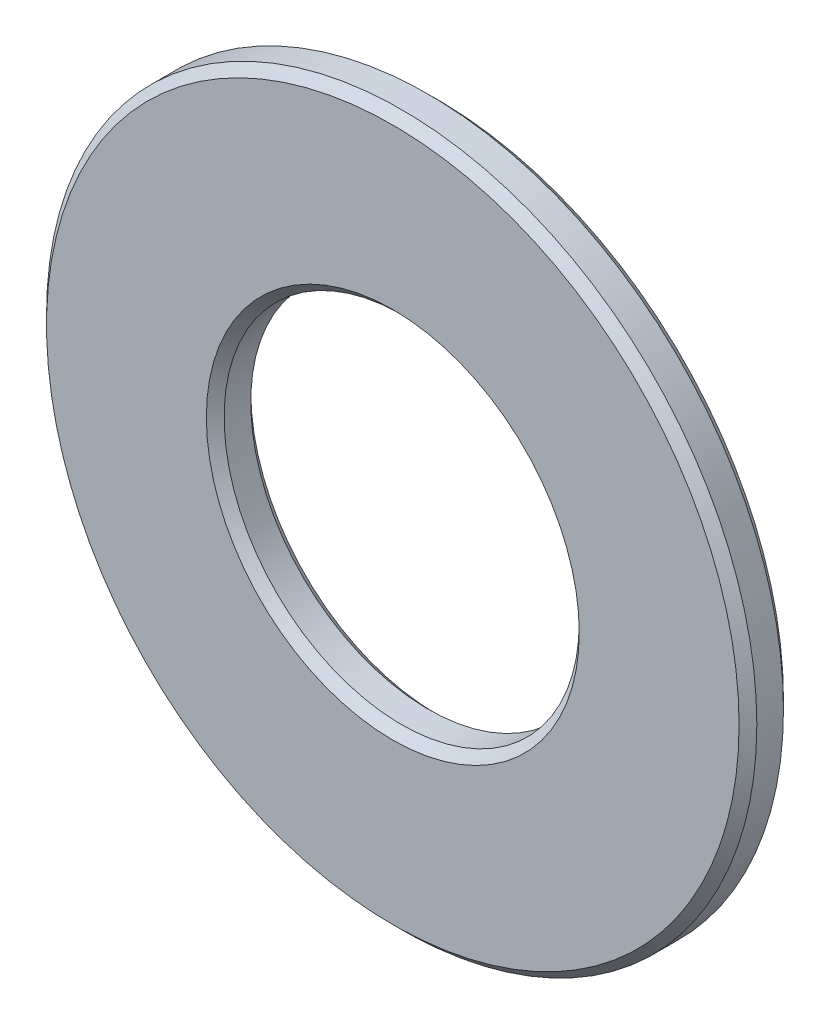
ISO-10303-21;
HEADER;
FILE_DESCRIPTION(('STEP AP214'),'2;1');
FILE_NAME('part.step','',(''),(''),'','','');
FILE_SCHEMA(('AUTOMOTIVE_DESIGN { 1 0 10303 214 1 1 1 1 }'));
ENDSEC;
DATA;
#1=APPLICATION_CONTEXT('core data for automotive mechanical design processes');
#2=APPLICATION_PROTOCOL_DEFINITION('international standard','automotive_design',2000,#1);
#3=PRODUCT_CONTEXT('',#1,'mechanical');
#4=PRODUCT('Part','Part','',(#3));
#5=PRODUCT_RELATED_PRODUCT_CATEGORY('part','',(#4));
#6=PRODUCT_DEFINITION_FORMATION('','',#4);
#7=PRODUCT_DEFINITION_CONTEXT('part definition',#1,'design');
#8=PRODUCT_DEFINITION('design','',#6,#7);
#9=PRODUCT_DEFINITION_SHAPE('','',#8);
#10=(LENGTH_UNIT() NAMED_UNIT(*) SI_UNIT(.MILLI.,.METRE.));
#11=(NAMED_UNIT(*) PLANE_ANGLE_UNIT() SI_UNIT($,.RADIAN.));
#12=(NAMED_UNIT(*) SI_UNIT($,.STERADIAN.) SOLID_ANGLE_UNIT());
#13=UNCERTAINTY_MEASURE_WITH_UNIT(LENGTH_MEASURE(1.E-05),#10,'distance_accuracy_value','');
#14=(GEOMETRIC_REPRESENTATION_CONTEXT(3) GLOBAL_UNCERTAINTY_ASSIGNED_CONTEXT((#13)) GLOBAL_UNIT_ASSIGNED_CONTEXT((#10,
#11,#12)) REPRESENTATION_CONTEXT('',''));
#15=CARTESIAN_POINT('',(0.,0.,0.));
#16=DIRECTION('',(0.,0.,1.));
#17=DIRECTION('',(1.,0.,0.));
#18=AXIS2_PLACEMENT_3D('',#15,#16,#17);
#19=CARTESIAN_POINT('',(0.,0.,0.25));
#20=DIRECTION('',(0.,0.,1.));
#21=DIRECTION('',(1.,0.,0.));
#22=AXIS2_PLACEMENT_3D('',#19,#20,#21);
#23=PLANE('',#22);
#24=CARTESIAN_POINT('',(0.,0.,0.25));
#25=DIRECTION('',(0.,0.,1.));
#26=DIRECTION('',(1.,0.,0.));
#27=AXIS2_PLACEMENT_3D('',#24,#25,#26);
#28=CIRCLE('',#27,2.1);
#29=CARTESIAN_POINT('',(2.1,0.,0.25));
#30=VERTEX_POINT('',#29);
#31=EDGE_CURVE('E56',#30,#30,#28,.F.);
#32=ORIENTED_EDGE('',*,*,#31,.T.);
#33=EDGE_LOOP('',(#32));
#34=FACE_BOUND('',#33,.T.);
#35=CARTESIAN_POINT('',(0.,0.,0.25));
#36=DIRECTION('',(0.,0.,1.));
#37=DIRECTION('',(1.,0.,0.));
#38=AXIS2_PLACEMENT_3D('',#35,#36,#37);
#39=CIRCLE('',#38,3.9);
#40=CARTESIAN_POINT('',(3.9,0.,0.25));
#41=VERTEX_POINT('',#40);
#42=EDGE_CURVE('E59',#41,#41,#39,.T.);
#43=ORIENTED_EDGE('',*,*,#42,.T.);
#44=EDGE_LOOP('',(#43));
#45=FACE_BOUND('',#44,.T.);
#46=ADVANCED_FACE('F35',(#34,#45),#23,.T.);
#47=CARTESIAN_POINT('',(0.,0.,-0.25));
#48=DIRECTION('',(0.,0.,1.));
#49=DIRECTION('',(1.,0.,0.));
#50=AXIS2_PLACEMENT_3D('',#47,#48,#49);
#51=PLANE('',#50);
#52=CARTESIAN_POINT('',(0.,0.,-0.25));
#53=DIRECTION('',(0.,0.,1.));
#54=DIRECTION('',(1.,0.,0.));
#55=AXIS2_PLACEMENT_3D('',#52,#53,#54);
#56=CIRCLE('',#55,2.1);
#57=CARTESIAN_POINT('',(2.1,0.,-0.25));
#58=VERTEX_POINT('',#57);
#59=EDGE_CURVE('E47',#58,#58,#56,.T.);
#60=ORIENTED_EDGE('',*,*,#59,.T.);
#61=EDGE_LOOP('',(#60));
#62=FACE_BOUND('',#61,.T.);
#63=CARTESIAN_POINT('',(0.,0.,-0.25));
#64=DIRECTION('',(0.,0.,1.));
#65=DIRECTION('',(1.,0.,0.));
#66=AXIS2_PLACEMENT_3D('',#63,#64,#65);
#67=CIRCLE('',#66,3.9);
#68=CARTESIAN_POINT('',(3.9,0.,-0.25));
#69=VERTEX_POINT('',#68);
#70=EDGE_CURVE('E51',#69,#69,#67,.F.);
#71=ORIENTED_EDGE('',*,*,#70,.T.);
#72=EDGE_LOOP('',(#71));
#73=FACE_BOUND('',#72,.T.);
#74=ADVANCED_FACE('F79',(#62,#73),#51,.F.);
#75=CARTESIAN_POINT('',(0.,0.,0.25));
#76=DIRECTION('',(0.,0.,-1.));
#77=DIRECTION('',(-1.,0.,0.));
#78=AXIS2_PLACEMENT_3D('',#75,#76,#77);
#79=CYLINDRICAL_SURFACE('',#78,4.);
#80=CARTESIAN_POINT('',(0.,0.,-0.150000000000001));
#81=DIRECTION('',(0.,0.,1.));
#82=DIRECTION('',(1.,0.,0.));
#83=AXIS2_PLACEMENT_3D('',#80,#81,#82);
#84=CIRCLE('',#83,4.);
#85=CARTESIAN_POINT('',(4.,0.,-0.150000000000001));
#86=VERTEX_POINT('',#85);
#87=EDGE_CURVE('E10',#86,#86,#84,.T.);
#88=ORIENTED_EDGE('',*,*,#87,.T.);
#89=EDGE_LOOP('',(#88));
#90=FACE_BOUND('',#89,.T.);
#91=CARTESIAN_POINT('',(0.,0.,0.150000000000002));
#92=DIRECTION('',(0.,0.,1.));
#93=DIRECTION('',(1.,0.,0.));
#94=AXIS2_PLACEMENT_3D('',#91,#92,#93);
#95=CIRCLE('',#94,4.);
#96=CARTESIAN_POINT('',(4.,0.,0.150000000000002));
#97=VERTEX_POINT('',#96);
#98=EDGE_CURVE('E43',#97,#97,#95,.F.);
#99=ORIENTED_EDGE('',*,*,#98,.T.);
#100=EDGE_LOOP('',(#99));
#101=FACE_BOUND('',#100,.T.);
#102=ADVANCED_FACE('F82',(#90,#101),#79,.T.);
#103=CARTESIAN_POINT('',(0.,0.,0.25));
#104=DIRECTION('',(0.,0.,-1.));
#105=DIRECTION('',(-1.,0.,0.));
#106=AXIS2_PLACEMENT_3D('',#103,#104,#105);
#107=CYLINDRICAL_SURFACE('',#106,2.);
#108=CARTESIAN_POINT('',(0.,0.,0.150000000000003));
#109=DIRECTION('',(0.,0.,1.));
#110=DIRECTION('',(1.,0.,0.));
#111=AXIS2_PLACEMENT_3D('',#108,#109,#110);
#112=CIRCLE('',#111,2.);
#113=CARTESIAN_POINT('',(2.,0.,0.150000000000003));
#114=VERTEX_POINT('',#113);
#115=EDGE_CURVE('E62',#114,#114,#112,.T.);
#116=ORIENTED_EDGE('',*,*,#115,.T.);
#117=EDGE_LOOP('',(#116));
#118=FACE_BOUND('',#117,.T.);
#119=CARTESIAN_POINT('',(0.,0.,-0.150000000000001));
#120=DIRECTION('',(0.,0.,1.));
#121=DIRECTION('',(1.,0.,0.));
#122=AXIS2_PLACEMENT_3D('',#119,#120,#121);
#123=CIRCLE('',#122,2.);
#124=CARTESIAN_POINT('',(2.,0.,-0.150000000000001));
#125=VERTEX_POINT('',#124);
#126=EDGE_CURVE('E65',#125,#125,#123,.F.);
#127=ORIENTED_EDGE('',*,*,#126,.T.);
#128=EDGE_LOOP('',(#127));
#129=FACE_BOUND('',#128,.T.);
#130=ADVANCED_FACE('F69',(#118,#129),#107,.F.);
#131=CARTESIAN_POINT('',(0.,0.,0.150000000000003));
#132=DIRECTION('',(0.,0.,1.));
#133=DIRECTION('',(1.,0.,0.));
#134=AXIS2_PLACEMENT_3D('',#131,#132,#133);
#135=CONICAL_SURFACE('',#134,2.,0.785398163397453);
#136=CARTESIAN_POINT('',(2.1,0.,0.25));
#137=CARTESIAN_POINT('',(2.09895833333333,0.,0.248958333333333));
#138=CARTESIAN_POINT('',(2.09791666666666,0.,0.247916666666667));
#139=CARTESIAN_POINT('',(2.09583333333333,0.,0.245833333333333));
#140=CARTESIAN_POINT('',(2.09479166666666,0.,0.244791666666667));
#141=CARTESIAN_POINT('',(2.09270833333333,0.,0.242708333333333));
#142=CARTESIAN_POINT('',(2.09166666666666,0.,0.241666666666667));
#143=CARTESIAN_POINT('',(2.08958333333333,0.,0.239583333333334));
#144=CARTESIAN_POINT('',(2.08854166666666,0.,0.238541666666667));
#145=CARTESIAN_POINT('',(2.08645833333333,0.,0.236458333333334));
#146=CARTESIAN_POINT('',(2.08541666666666,0.,0.235416666666667));
#147=CARTESIAN_POINT('',(2.08333333333333,0.,0.233333333333334));
#148=CARTESIAN_POINT('',(2.08229166666666,0.,0.232291666666667));
#149=CARTESIAN_POINT('',(2.08020833333333,0.,0.230208333333334));
#150=CARTESIAN_POINT('',(2.07916666666666,0.,0.229166666666667));
#151=CARTESIAN_POINT('',(2.07708333333333,0.,0.227083333333334));
#152=CARTESIAN_POINT('',(2.07604166666667,0.,0.226041666666667));
#153=CARTESIAN_POINT('',(2.07395833333333,0.,0.223958333333334));
#154=CARTESIAN_POINT('',(2.07291666666666,0.,0.222916666666668));
#155=CARTESIAN_POINT('',(2.07083333333333,0.,0.220833333333334));
#156=CARTESIAN_POINT('',(2.06979166666666,0.,0.219791666666668));
#157=CARTESIAN_POINT('',(2.06770833333333,0.,0.217708333333334));
#158=CARTESIAN_POINT('',(2.06666666666667,0.,0.216666666666668));
#159=CARTESIAN_POINT('',(2.06458333333333,0.,0.214583333333334));
#160=CARTESIAN_POINT('',(2.06354166666666,0.,0.213541666666668));
#161=CARTESIAN_POINT('',(2.06145833333333,0.,0.211458333333335));
#162=CARTESIAN_POINT('',(2.06041666666667,0.,0.210416666666668));
#163=CARTESIAN_POINT('',(2.05833333333333,0.,0.208333333333335));
#164=CARTESIAN_POINT('',(2.05729166666667,0.,0.207291666666668));
#165=CARTESIAN_POINT('',(2.05520833333333,0.,0.205208333333335));
#166=CARTESIAN_POINT('',(2.05416666666667,0.,0.204166666666668));
#167=CARTESIAN_POINT('',(2.05208333333333,0.,0.202083333333335));
#168=CARTESIAN_POINT('',(2.05104166666667,0.,0.201041666666668));
#169=CARTESIAN_POINT('',(2.04895833333333,0.,0.198958333333335));
#170=CARTESIAN_POINT('',(2.04791666666667,0.,0.197916666666668));
#171=CARTESIAN_POINT('',(2.04583333333333,0.,0.195833333333335));
#172=CARTESIAN_POINT('',(2.04479166666667,0.,0.194791666666668));
#173=CARTESIAN_POINT('',(2.04270833333333,0.,0.192708333333335));
#174=CARTESIAN_POINT('',(2.04166666666667,0.,0.191666666666668));
#175=CARTESIAN_POINT('',(2.03958333333333,0.,0.189583333333335));
#176=CARTESIAN_POINT('',(2.03854166666667,0.,0.188541666666669));
#177=CARTESIAN_POINT('',(2.03645833333333,0.,0.186458333333335));
#178=CARTESIAN_POINT('',(2.03541666666667,0.,0.185416666666669));
#179=CARTESIAN_POINT('',(2.03333333333333,0.,0.183333333333335));
#180=CARTESIAN_POINT('',(2.03229166666667,0.,0.182291666666669));
#181=CARTESIAN_POINT('',(2.03020833333333,0.,0.180208333333336));
#182=CARTESIAN_POINT('',(2.02916666666667,0.,0.179166666666669));
#183=CARTESIAN_POINT('',(2.02708333333333,0.,0.177083333333336));
#184=CARTESIAN_POINT('',(2.02604166666667,0.,0.176041666666669));
#185=CARTESIAN_POINT('',(2.02395833333333,0.,0.173958333333336));
#186=CARTESIAN_POINT('',(2.02291666666667,0.,0.172916666666669));
#187=CARTESIAN_POINT('',(2.02083333333333,0.,0.170833333333336));
#188=CARTESIAN_POINT('',(2.01979166666667,0.,0.169791666666669));
#189=CARTESIAN_POINT('',(2.01770833333333,0.,0.167708333333336));
#190=CARTESIAN_POINT('',(2.01666666666667,0.,0.166666666666669));
#191=CARTESIAN_POINT('',(2.01458333333333,0.,0.164583333333336));
#192=CARTESIAN_POINT('',(2.01354166666667,0.,0.163541666666669));
#193=CARTESIAN_POINT('',(2.01145833333333,0.,0.161458333333336));
#194=CARTESIAN_POINT('',(2.01041666666667,0.,0.160416666666669));
#195=CARTESIAN_POINT('',(2.00833333333333,0.,0.158333333333336));
#196=CARTESIAN_POINT('',(2.00729166666667,0.,0.15729166666667));
#197=CARTESIAN_POINT('',(2.00520833333333,0.,0.155208333333336));
#198=CARTESIAN_POINT('',(2.00416666666667,0.,0.15416666666667));
#199=CARTESIAN_POINT('',(2.00208333333333,0.,0.152083333333336));
#200=CARTESIAN_POINT('',(2.00104166666667,0.,0.15104166666667));
#201=CARTESIAN_POINT('',(2.,0.,0.150000000000003));
#202=B_SPLINE_CURVE_WITH_KNOTS('',3,(#136,#137,#138,#139,#140,#141,#142,#143,#144,#145,#146,
#147,#148,#149,#150,#151,#152,#153,#154,#155,#156,#157,#158,#159,#160,#161,#162,#163,#164,#165,
#166,#167,#168,#169,#170,#171,#172,#173,#174,#175,#176,#177,#178,#179,#180,#181,#182,#183,#184,
#185,#186,#187,#188,#189,#190,#191,#192,#193,#194,#195,#196,#197,#198,#199,#200,#201),
.UNSPECIFIED.,.F.,.F.,(4,2,2,2,2,2,2,2,2,2,2,2,2,2,2,2,2,2,2,2,2,2,2,2,2,2,2,2,2,2,2,2,4),(0.,
0.0044194173824159,0.00883883476483152,0.0132582521472474,0.0176776695296634,0.0220970869120789,
0.0265165042944949,0.0309359216769105,0.0353553390593264,0.0397747564417423,0.0441941738241579,
0.0486135912065738,0.0530330085889897,0.0574524259714053,0.0618718433538212,0.0662912607362369,
0.0707106781186528,0.0751300955010687,0.0795495128834843,0.0839689302659002,0.0883883476483161,
0.0928077650307317,0.0972271824131476,0.101646599795563,0.106066017177979,0.110485434560395,
0.114904851942811,0.119324269325227,0.123743686707642,0.128163104090058,0.132582521472474,
0.13700193885489,0.141421356237306),.UNSPECIFIED.);
#203=EDGE_CURVE('BSEAM75',#30,#114,#202,.T.);
#204=ORIENTED_EDGE('',*,*,#31,.F.);
#205=ORIENTED_EDGE('',*,*,#115,.F.);
#206=ORIENTED_EDGE('',*,*,#203,.T.);
#207=ORIENTED_EDGE('',*,*,#203,.F.);
#208=EDGE_LOOP('',(#204,#206,#205,#207));
#209=FACE_BOUND('',#208,.T.);
#210=ADVANCED_FACE('F75',(#209),#135,.F.);
#211=CARTESIAN_POINT('',(0.,0.,-0.25));
#212=DIRECTION('',(0.,0.,-1.));
#213=DIRECTION('',(-1.,0.,0.));
#214=AXIS2_PLACEMENT_3D('',#211,#212,#213);
#215=CONICAL_SURFACE('',#214,2.1,0.785398163397444);
#216=ORIENTED_EDGE('',*,*,#126,.F.);
#217=EDGE_LOOP('',(#216));
#218=FACE_BOUND('',#217,.T.);
#219=ORIENTED_EDGE('',*,*,#59,.F.);
#220=EDGE_LOOP('',(#219));
#221=FACE_BOUND('',#220,.T.);
#222=ADVANCED_FACE('F71',(#218,#221),#215,.F.);
#223=CARTESIAN_POINT('',(0.,0.,-0.150000000000001));
#224=DIRECTION('',(0.,0.,1.));
#225=DIRECTION('',(1.,0.,0.));
#226=AXIS2_PLACEMENT_3D('',#223,#224,#225);
#227=CONICAL_SURFACE('',#226,4.,0.785398163397444);
#228=ORIENTED_EDGE('',*,*,#70,.F.);
#229=EDGE_LOOP('',(#228));
#230=FACE_BOUND('',#229,.T.);
#231=ORIENTED_EDGE('',*,*,#87,.F.);
#232=EDGE_LOOP('',(#231));
#233=FACE_BOUND('',#232,.T.);
#234=ADVANCED_FACE('F74',(#230,#233),#227,.T.);
#235=CARTESIAN_POINT('',(0.,0.,0.25));
#236=DIRECTION('',(0.,0.,-1.));
#237=DIRECTION('',(-1.,0.,0.));
#238=AXIS2_PLACEMENT_3D('',#235,#236,#237);
#239=CONICAL_SURFACE('',#238,3.9,0.785398163397448);
#240=ORIENTED_EDGE('',*,*,#98,.F.);
#241=EDGE_LOOP('',(#240));
#242=FACE_BOUND('',#241,.T.);
#243=ORIENTED_EDGE('',*,*,#42,.F.);
#244=EDGE_LOOP('',(#243));
#245=FACE_BOUND('',#244,.T.);
#246=ADVANCED_FACE('F38',(#242,#245),#239,.T.);
#247=CLOSED_SHELL('',(#46,#74,#102,#130,#210,#222,#234,#246));
#248=MANIFOLD_SOLID_BREP('B2',#247);
#249=ADVANCED_BREP_SHAPE_REPRESENTATION('',(#18,#248),#14);
#250=SHAPE_DEFINITION_REPRESENTATION(#9,#249);
ENDSEC;
END-ISO-10303-21;
